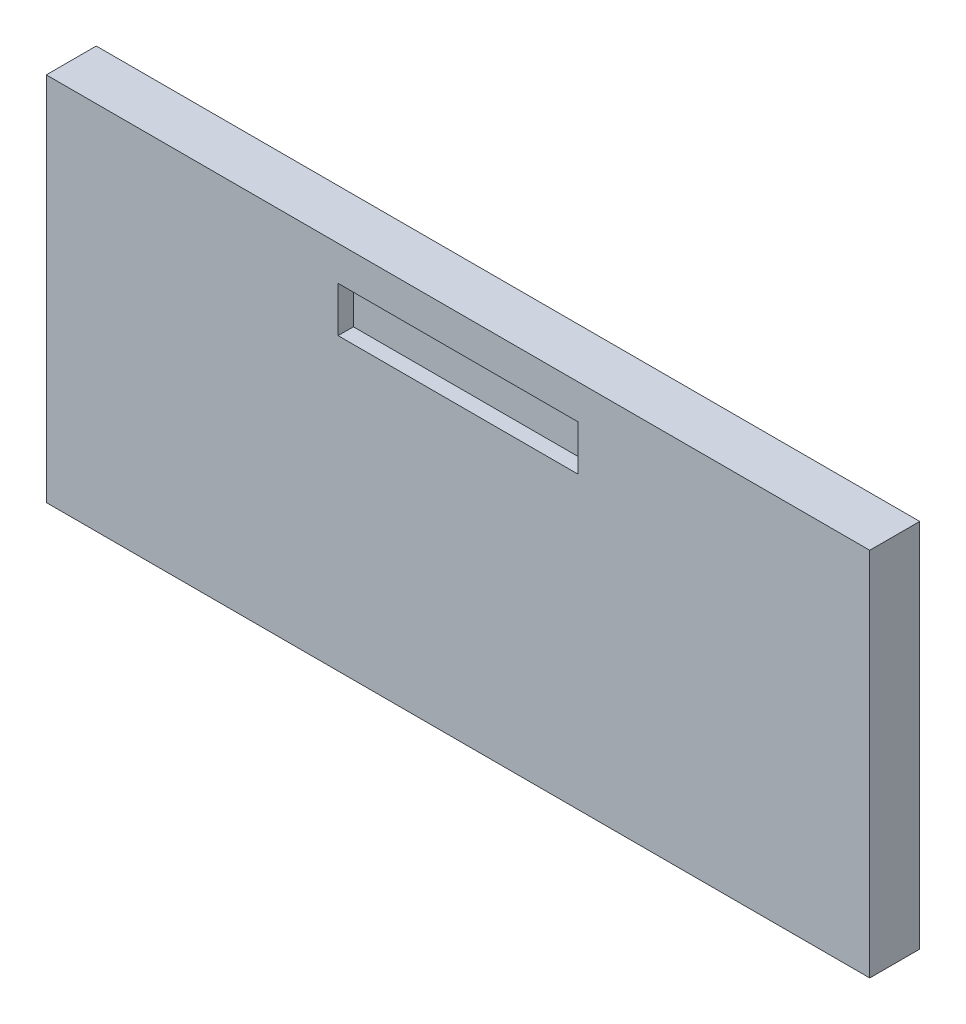
ISO-10303-21;
HEADER;
FILE_DESCRIPTION(('STEP AP214'),'2;1');
FILE_NAME('part.step','',(''),(''),'','','');
FILE_SCHEMA(('AUTOMOTIVE_DESIGN { 1 0 10303 214 1 1 1 1 }'));
ENDSEC;
DATA;
#1=APPLICATION_CONTEXT('core data for automotive mechanical design processes');
#2=APPLICATION_PROTOCOL_DEFINITION('international standard','automotive_design',2000,#1);
#3=PRODUCT_CONTEXT('',#1,'mechanical');
#4=PRODUCT('Part','Part','',(#3));
#5=PRODUCT_RELATED_PRODUCT_CATEGORY('part','',(#4));
#6=PRODUCT_DEFINITION_FORMATION('','',#4);
#7=PRODUCT_DEFINITION_CONTEXT('part definition',#1,'design');
#8=PRODUCT_DEFINITION('design','',#6,#7);
#9=PRODUCT_DEFINITION_SHAPE('','',#8);
#10=(LENGTH_UNIT() NAMED_UNIT(*) SI_UNIT(.MILLI.,.METRE.));
#11=(NAMED_UNIT(*) PLANE_ANGLE_UNIT() SI_UNIT($,.RADIAN.));
#12=(NAMED_UNIT(*) SI_UNIT($,.STERADIAN.) SOLID_ANGLE_UNIT());
#13=UNCERTAINTY_MEASURE_WITH_UNIT(LENGTH_MEASURE(1.E-05),#10,'distance_accuracy_value','');
#14=(GEOMETRIC_REPRESENTATION_CONTEXT(3) GLOBAL_UNCERTAINTY_ASSIGNED_CONTEXT((#13)) GLOBAL_UNIT_ASSIGNED_CONTEXT((#10,
#11,#12)) REPRESENTATION_CONTEXT('',''));
#15=CARTESIAN_POINT('',(0.,0.,0.));
#16=DIRECTION('',(0.,0.,1.));
#17=DIRECTION('',(1.,0.,0.));
#18=AXIS2_PLACEMENT_3D('',#15,#16,#17);
#19=CARTESIAN_POINT('',(0.,0.,38.5));
#20=DIRECTION('',(0.,0.,-1.));
#21=DIRECTION('',(-1.,0.,0.));
#22=AXIS2_PLACEMENT_3D('',#19,#20,#21);
#23=PLANE('',#22);
#24=DIRECTION('',(0.,-1.,0.));
#25=VECTOR('',#24,1.);
#26=CARTESIAN_POINT('',(69.,406.,38.5));
#27=LINE('',#26,#25);
#28=CARTESIAN_POINT('',(69.,684.,38.5));
#29=VERTEX_POINT('',#28);
#30=CARTESIAN_POINT('',(69.,406.,38.5));
#31=VERTEX_POINT('',#30);
#32=EDGE_CURVE('E145',#29,#31,#27,.T.);
#33=ORIENTED_EDGE('',*,*,#32,.T.);
#34=DIRECTION('',(1.,0.,0.));
#35=VECTOR('',#34,1.);
#36=CARTESIAN_POINT('',(69.,406.,38.5));
#37=LINE('',#36,#35);
#38=CARTESIAN_POINT('',(687.,406.,38.5));
#39=VERTEX_POINT('',#38);
#40=EDGE_CURVE('E92',#31,#39,#37,.T.);
#41=ORIENTED_EDGE('',*,*,#40,.T.);
#42=DIRECTION('',(0.,1.,0.));
#43=VECTOR('',#42,1.);
#44=CARTESIAN_POINT('',(687.,406.,38.5));
#45=LINE('',#44,#43);
#46=CARTESIAN_POINT('',(687.,684.,38.5));
#47=VERTEX_POINT('',#46);
#48=EDGE_CURVE('E148',#39,#47,#45,.T.);
#49=ORIENTED_EDGE('',*,*,#48,.T.);
#50=DIRECTION('',(-1.,0.,0.));
#51=VECTOR('',#50,1.);
#52=CARTESIAN_POINT('',(69.,684.,38.5));
#53=LINE('',#52,#51);
#54=EDGE_CURVE('E63',#47,#29,#53,.T.);
#55=ORIENTED_EDGE('',*,*,#54,.T.);
#56=EDGE_LOOP('',(#33,#41,#49,#55));
#57=FACE_BOUND('',#56,.T.);
#58=DIRECTION('',(0.,-1.,0.));
#59=VECTOR('',#58,1.);
#60=CARTESIAN_POINT('',(288.,0.,38.5));
#61=LINE('',#60,#59);
#62=CARTESIAN_POINT('',(288.,658.,38.5));
#63=VERTEX_POINT('',#62);
#64=CARTESIAN_POINT('',(288.,624.,38.5));
#65=VERTEX_POINT('',#64);
#66=EDGE_CURVE('E11',#63,#65,#61,.T.);
#67=ORIENTED_EDGE('',*,*,#66,.F.);
#68=DIRECTION('',(-1.,0.,0.));
#69=VECTOR('',#68,1.);
#70=CARTESIAN_POINT('',(0.,658.,38.5));
#71=LINE('',#70,#69);
#72=CARTESIAN_POINT('',(468.,658.,38.5));
#73=VERTEX_POINT('',#72);
#74=EDGE_CURVE('E167',#73,#63,#71,.T.);
#75=ORIENTED_EDGE('',*,*,#74,.F.);
#76=DIRECTION('',(0.,1.,0.));
#77=VECTOR('',#76,1.);
#78=CARTESIAN_POINT('',(468.,0.,38.5));
#79=LINE('',#78,#77);
#80=CARTESIAN_POINT('',(468.,624.,38.5));
#81=VERTEX_POINT('',#80);
#82=EDGE_CURVE('E169',#81,#73,#79,.T.);
#83=ORIENTED_EDGE('',*,*,#82,.F.);
#84=DIRECTION('',(1.,0.,0.));
#85=VECTOR('',#84,1.);
#86=CARTESIAN_POINT('',(0.,624.,38.5));
#87=LINE('',#86,#85);
#88=EDGE_CURVE('E47',#65,#81,#87,.T.);
#89=ORIENTED_EDGE('',*,*,#88,.F.);
#90=EDGE_LOOP('',(#67,#75,#83,#89));
#91=FACE_BOUND('',#90,.T.);
#92=ADVANCED_FACE('F39',(#57,#91),#23,.F.);
#93=CARTESIAN_POINT('',(69.,406.,38.5));
#94=DIRECTION('',(1.,0.,0.));
#95=DIRECTION('',(0.,0.,-1.));
#96=AXIS2_PLACEMENT_3D('',#93,#94,#95);
#97=PLANE('',#96);
#98=DIRECTION('',(0.,-1.,0.));
#99=VECTOR('',#98,1.);
#100=CARTESIAN_POINT('',(69.,406.,1.));
#101=LINE('',#100,#99);
#102=CARTESIAN_POINT('',(69.,684.,1.));
#103=VERTEX_POINT('',#102);
#104=CARTESIAN_POINT('',(69.,406.,1.));
#105=VERTEX_POINT('',#104);
#106=EDGE_CURVE('E122',#103,#105,#101,.T.);
#107=ORIENTED_EDGE('',*,*,#106,.T.);
#108=DIRECTION('',(0.,0.,-1.));
#109=VECTOR('',#108,1.);
#110=CARTESIAN_POINT('',(69.,406.,38.5));
#111=LINE('',#110,#109);
#112=EDGE_CURVE('E165',#31,#105,#111,.T.);
#113=ORIENTED_EDGE('',*,*,#112,.F.);
#114=ORIENTED_EDGE('',*,*,#32,.F.);
#115=DIRECTION('',(0.,0.,-1.));
#116=VECTOR('',#115,1.);
#117=CARTESIAN_POINT('',(69.,684.,38.5));
#118=LINE('',#117,#116);
#119=EDGE_CURVE('E151',#29,#103,#118,.T.);
#120=ORIENTED_EDGE('',*,*,#119,.T.);
#121=EDGE_LOOP('',(#107,#113,#114,#120));
#122=FACE_BOUND('',#121,.T.);
#123=ADVANCED_FACE('F41',(#122),#97,.F.);
#124=CARTESIAN_POINT('',(69.,406.,38.5));
#125=DIRECTION('',(0.,1.,0.));
#126=DIRECTION('',(0.,0.,1.));
#127=AXIS2_PLACEMENT_3D('',#124,#125,#126);
#128=PLANE('',#127);
#129=DIRECTION('',(1.,0.,0.));
#130=VECTOR('',#129,1.);
#131=CARTESIAN_POINT('',(69.,406.,1.));
#132=LINE('',#131,#130);
#133=CARTESIAN_POINT('',(687.,406.,1.));
#134=VERTEX_POINT('',#133);
#135=EDGE_CURVE('E154',#105,#134,#132,.T.);
#136=ORIENTED_EDGE('',*,*,#135,.T.);
#137=DIRECTION('',(0.,0.,-1.));
#138=VECTOR('',#137,1.);
#139=CARTESIAN_POINT('',(687.,406.,38.5));
#140=LINE('',#139,#138);
#141=EDGE_CURVE('E162',#39,#134,#140,.T.);
#142=ORIENTED_EDGE('',*,*,#141,.F.);
#143=ORIENTED_EDGE('',*,*,#40,.F.);
#144=ORIENTED_EDGE('',*,*,#112,.T.);
#145=EDGE_LOOP('',(#136,#142,#143,#144));
#146=FACE_BOUND('',#145,.T.);
#147=ADVANCED_FACE('F191',(#146),#128,.F.);
#148=CARTESIAN_POINT('',(687.,406.,38.5));
#149=DIRECTION('',(-1.,0.,0.));
#150=DIRECTION('',(0.,0.,1.));
#151=AXIS2_PLACEMENT_3D('',#148,#149,#150);
#152=PLANE('',#151);
#153=DIRECTION('',(0.,1.,0.));
#154=VECTOR('',#153,1.);
#155=CARTESIAN_POINT('',(687.,406.,1.));
#156=LINE('',#155,#154);
#157=CARTESIAN_POINT('',(687.,684.,1.));
#158=VERTEX_POINT('',#157);
#159=EDGE_CURVE('E156',#134,#158,#156,.T.);
#160=ORIENTED_EDGE('',*,*,#159,.T.);
#161=DIRECTION('',(0.,0.,-1.));
#162=VECTOR('',#161,1.);
#163=CARTESIAN_POINT('',(687.,684.,38.5));
#164=LINE('',#163,#162);
#165=EDGE_CURVE('E160',#47,#158,#164,.T.);
#166=ORIENTED_EDGE('',*,*,#165,.F.);
#167=ORIENTED_EDGE('',*,*,#48,.F.);
#168=ORIENTED_EDGE('',*,*,#141,.T.);
#169=EDGE_LOOP('',(#160,#166,#167,#168));
#170=FACE_BOUND('',#169,.T.);
#171=ADVANCED_FACE('F202',(#170),#152,.F.);
#172=CARTESIAN_POINT('',(69.,684.,38.5));
#173=DIRECTION('',(0.,-1.,0.));
#174=DIRECTION('',(0.,0.,-1.));
#175=AXIS2_PLACEMENT_3D('',#172,#173,#174);
#176=PLANE('',#175);
#177=DIRECTION('',(-1.,0.,0.));
#178=VECTOR('',#177,1.);
#179=CARTESIAN_POINT('',(69.,684.,1.));
#180=LINE('',#179,#178);
#181=EDGE_CURVE('E84',#158,#103,#180,.T.);
#182=ORIENTED_EDGE('',*,*,#181,.T.);
#183=ORIENTED_EDGE('',*,*,#119,.F.);
#184=ORIENTED_EDGE('',*,*,#54,.F.);
#185=ORIENTED_EDGE('',*,*,#165,.T.);
#186=EDGE_LOOP('',(#182,#183,#184,#185));
#187=FACE_BOUND('',#186,.T.);
#188=ADVANCED_FACE('F198',(#187),#176,.F.);
#189=CARTESIAN_POINT('',(0.,0.,1.));
#190=DIRECTION('',(0.,0.,-1.));
#191=DIRECTION('',(-1.,0.,0.));
#192=AXIS2_PLACEMENT_3D('',#189,#190,#191);
#193=PLANE('',#192);
#194=ORIENTED_EDGE('',*,*,#106,.F.);
#195=ORIENTED_EDGE('',*,*,#181,.F.);
#196=ORIENTED_EDGE('',*,*,#159,.F.);
#197=ORIENTED_EDGE('',*,*,#135,.F.);
#198=EDGE_LOOP('',(#194,#195,#196,#197));
#199=FACE_BOUND('',#198,.T.);
#200=ADVANCED_FACE('F196',(#199),#193,.T.);
#201=CARTESIAN_POINT('',(288.,624.,41.));
#202=DIRECTION('',(1.,0.,0.));
#203=DIRECTION('',(0.,0.,-1.));
#204=AXIS2_PLACEMENT_3D('',#201,#202,#203);
#205=PLANE('',#204);
#206=ORIENTED_EDGE('',*,*,#66,.T.);
#207=DIRECTION('',(0.,0.,-1.));
#208=VECTOR('',#207,1.);
#209=CARTESIAN_POINT('',(288.,624.,41.));
#210=LINE('',#209,#208);
#211=CARTESIAN_POINT('',(288.,624.,27.));
#212=VERTEX_POINT('',#211);
#213=EDGE_CURVE('E113',#65,#212,#210,.T.);
#214=ORIENTED_EDGE('',*,*,#213,.T.);
#215=DIRECTION('',(0.,-1.,0.));
#216=VECTOR('',#215,1.);
#217=CARTESIAN_POINT('',(288.,624.,27.));
#218=LINE('',#217,#216);
#219=CARTESIAN_POINT('',(288.,658.,27.));
#220=VERTEX_POINT('',#219);
#221=EDGE_CURVE('E118',#220,#212,#218,.T.);
#222=ORIENTED_EDGE('',*,*,#221,.F.);
#223=DIRECTION('',(0.,0.,-1.));
#224=VECTOR('',#223,1.);
#225=CARTESIAN_POINT('',(288.,658.,41.));
#226=LINE('',#225,#224);
#227=EDGE_CURVE('E141',#63,#220,#226,.T.);
#228=ORIENTED_EDGE('',*,*,#227,.F.);
#229=EDGE_LOOP('',(#206,#214,#222,#228));
#230=FACE_BOUND('',#229,.T.);
#231=ADVANCED_FACE('F115',(#230),#205,.T.);
#232=CARTESIAN_POINT('',(288.,624.,41.));
#233=DIRECTION('',(0.,1.,0.));
#234=DIRECTION('',(0.,0.,1.));
#235=AXIS2_PLACEMENT_3D('',#232,#233,#234);
#236=PLANE('',#235);
#237=ORIENTED_EDGE('',*,*,#88,.T.);
#238=DIRECTION('',(0.,0.,-1.));
#239=VECTOR('',#238,1.);
#240=CARTESIAN_POINT('',(468.,624.,41.));
#241=LINE('',#240,#239);
#242=CARTESIAN_POINT('',(468.,624.,27.));
#243=VERTEX_POINT('',#242);
#244=EDGE_CURVE('E123',#81,#243,#241,.T.);
#245=ORIENTED_EDGE('',*,*,#244,.T.);
#246=DIRECTION('',(1.,0.,0.));
#247=VECTOR('',#246,1.);
#248=CARTESIAN_POINT('',(288.,624.,27.));
#249=LINE('',#248,#247);
#250=EDGE_CURVE('E126',#212,#243,#249,.T.);
#251=ORIENTED_EDGE('',*,*,#250,.F.);
#252=ORIENTED_EDGE('',*,*,#213,.F.);
#253=EDGE_LOOP('',(#237,#245,#251,#252));
#254=FACE_BOUND('',#253,.T.);
#255=ADVANCED_FACE('F127',(#254),#236,.T.);
#256=CARTESIAN_POINT('',(468.,624.,41.));
#257=DIRECTION('',(-1.,0.,0.));
#258=DIRECTION('',(0.,0.,1.));
#259=AXIS2_PLACEMENT_3D('',#256,#257,#258);
#260=PLANE('',#259);
#261=ORIENTED_EDGE('',*,*,#82,.T.);
#262=DIRECTION('',(0.,0.,-1.));
#263=VECTOR('',#262,1.);
#264=CARTESIAN_POINT('',(468.,658.,41.));
#265=LINE('',#264,#263);
#266=CARTESIAN_POINT('',(468.,658.,27.));
#267=VERTEX_POINT('',#266);
#268=EDGE_CURVE('E54',#73,#267,#265,.T.);
#269=ORIENTED_EDGE('',*,*,#268,.T.);
#270=DIRECTION('',(0.,1.,0.));
#271=VECTOR('',#270,1.);
#272=CARTESIAN_POINT('',(468.,624.,27.));
#273=LINE('',#272,#271);
#274=EDGE_CURVE('E132',#243,#267,#273,.T.);
#275=ORIENTED_EDGE('',*,*,#274,.F.);
#276=ORIENTED_EDGE('',*,*,#244,.F.);
#277=EDGE_LOOP('',(#261,#269,#275,#276));
#278=FACE_BOUND('',#277,.T.);
#279=ADVANCED_FACE('F173',(#278),#260,.T.);
#280=CARTESIAN_POINT('',(288.,658.,41.));
#281=DIRECTION('',(0.,-1.,0.));
#282=DIRECTION('',(0.,0.,-1.));
#283=AXIS2_PLACEMENT_3D('',#280,#281,#282);
#284=PLANE('',#283);
#285=ORIENTED_EDGE('',*,*,#74,.T.);
#286=ORIENTED_EDGE('',*,*,#227,.T.);
#287=DIRECTION('',(-1.,0.,0.));
#288=VECTOR('',#287,1.);
#289=CARTESIAN_POINT('',(288.,658.,27.));
#290=LINE('',#289,#288);
#291=EDGE_CURVE('E136',#267,#220,#290,.T.);
#292=ORIENTED_EDGE('',*,*,#291,.F.);
#293=ORIENTED_EDGE('',*,*,#268,.F.);
#294=EDGE_LOOP('',(#285,#286,#292,#293));
#295=FACE_BOUND('',#294,.T.);
#296=ADVANCED_FACE('F175',(#295),#284,.T.);
#297=CARTESIAN_POINT('',(0.,0.,27.));
#298=DIRECTION('',(0.,0.,-1.));
#299=DIRECTION('',(-1.,0.,0.));
#300=AXIS2_PLACEMENT_3D('',#297,#298,#299);
#301=PLANE('',#300);
#302=ORIENTED_EDGE('',*,*,#221,.T.);
#303=ORIENTED_EDGE('',*,*,#250,.T.);
#304=ORIENTED_EDGE('',*,*,#274,.T.);
#305=ORIENTED_EDGE('',*,*,#291,.T.);
#306=EDGE_LOOP('',(#302,#303,#304,#305));
#307=FACE_BOUND('',#306,.T.);
#308=ADVANCED_FACE('F135',(#307),#301,.F.);
#309=CLOSED_SHELL('',(#92,#123,#147,#171,#188,#200,#231,#255,#279,#296,#308));
#310=MANIFOLD_SOLID_BREP('B2',#309);
#311=ADVANCED_BREP_SHAPE_REPRESENTATION('',(#18,#310),#14);
#312=SHAPE_DEFINITION_REPRESENTATION(#9,#311);
ENDSEC;
END-ISO-10303-21;
